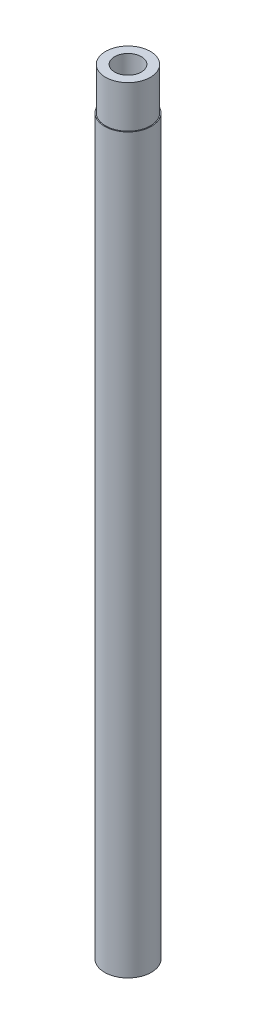
ISO-10303-21;
HEADER;
FILE_DESCRIPTION(('STEP AP214'),'2;1');
FILE_NAME('part.step','',(''),(''),'','','');
FILE_SCHEMA(('AUTOMOTIVE_DESIGN { 1 0 10303 214 1 1 1 1 }'));
ENDSEC;
DATA;
#1=APPLICATION_CONTEXT('core data for automotive mechanical design processes');
#2=APPLICATION_PROTOCOL_DEFINITION('international standard','automotive_design',2000,#1);
#3=PRODUCT_CONTEXT('',#1,'mechanical');
#4=PRODUCT('Part','Part','',(#3));
#5=PRODUCT_RELATED_PRODUCT_CATEGORY('part','',(#4));
#6=PRODUCT_DEFINITION_FORMATION('','',#4);
#7=PRODUCT_DEFINITION_CONTEXT('part definition',#1,'design');
#8=PRODUCT_DEFINITION('design','',#6,#7);
#9=PRODUCT_DEFINITION_SHAPE('','',#8);
#10=(LENGTH_UNIT() NAMED_UNIT(*) SI_UNIT(.MILLI.,.METRE.));
#11=(NAMED_UNIT(*) PLANE_ANGLE_UNIT() SI_UNIT($,.RADIAN.));
#12=(NAMED_UNIT(*) SI_UNIT($,.STERADIAN.) SOLID_ANGLE_UNIT());
#13=UNCERTAINTY_MEASURE_WITH_UNIT(LENGTH_MEASURE(1.E-05),#10,'distance_accuracy_value','');
#14=(GEOMETRIC_REPRESENTATION_CONTEXT(3) GLOBAL_UNCERTAINTY_ASSIGNED_CONTEXT((#13)) GLOBAL_UNIT_ASSIGNED_CONTEXT((#10,
#11,#12)) REPRESENTATION_CONTEXT('',''));
#15=CARTESIAN_POINT('',(0.,0.,0.));
#16=DIRECTION('',(0.,0.,1.));
#17=DIRECTION('',(1.,0.,0.));
#18=AXIS2_PLACEMENT_3D('',#15,#16,#17);
#19=CARTESIAN_POINT('',(0.,368.3,0.));
#20=DIRECTION('',(0.,-1.,0.));
#21=DIRECTION('',(0.,0.,-1.));
#22=AXIS2_PLACEMENT_3D('',#19,#20,#21);
#23=CYLINDRICAL_SURFACE('',#22,6.35);
#24=CARTESIAN_POINT('',(0.,368.3,0.));
#25=DIRECTION('',(0.,1.,0.));
#26=DIRECTION('',(0.,0.,1.));
#27=AXIS2_PLACEMENT_3D('',#24,#25,#26);
#28=CIRCLE('',#27,6.35);
#29=CARTESIAN_POINT('',(0.,368.3,6.35));
#30=VERTEX_POINT('',#29);
#31=EDGE_CURVE('E37',#30,#30,#28,.T.);
#32=ORIENTED_EDGE('',*,*,#31,.T.);
#33=EDGE_LOOP('',(#32));
#34=FACE_BOUND('',#33,.T.);
#35=CARTESIAN_POINT('',(0.,12.7,0.));
#36=DIRECTION('',(0.,-1.,0.));
#37=DIRECTION('',(0.,0.,-1.));
#38=AXIS2_PLACEMENT_3D('',#35,#36,#37);
#39=CIRCLE('',#38,6.35);
#40=CARTESIAN_POINT('',(0.,12.7,-6.35));
#41=VERTEX_POINT('',#40);
#42=EDGE_CURVE('E57',#41,#41,#39,.T.);
#43=ORIENTED_EDGE('',*,*,#42,.T.);
#44=EDGE_LOOP('',(#43));
#45=FACE_BOUND('',#44,.T.);
#46=ADVANCED_FACE('F30',(#34,#45),#23,.F.);
#47=CARTESIAN_POINT('',(0.,368.3,0.));
#48=DIRECTION('',(0.,1.,0.));
#49=DIRECTION('',(0.,0.,1.));
#50=AXIS2_PLACEMENT_3D('',#47,#48,#49);
#51=PLANE('',#50);
#52=ORIENTED_EDGE('',*,*,#31,.F.);
#53=EDGE_LOOP('',(#52));
#54=FACE_BOUND('',#53,.T.);
#55=CARTESIAN_POINT('',(0.,368.3,0.));
#56=DIRECTION('',(0.,1.,0.));
#57=DIRECTION('',(0.,0.,1.));
#58=AXIS2_PLACEMENT_3D('',#55,#56,#57);
#59=CIRCLE('',#58,10.668);
#60=CARTESIAN_POINT('',(0.,368.3,10.668));
#61=VERTEX_POINT('',#60);
#62=EDGE_CURVE('E48',#61,#61,#59,.T.);
#63=ORIENTED_EDGE('',*,*,#62,.T.);
#64=EDGE_LOOP('',(#63));
#65=FACE_BOUND('',#64,.T.);
#66=ADVANCED_FACE('F87',(#54,#65),#51,.T.);
#67=CARTESIAN_POINT('',(0.,368.3,0.));
#68=DIRECTION('',(0.,-1.,0.));
#69=DIRECTION('',(0.,0.,-1.));
#70=AXIS2_PLACEMENT_3D('',#67,#68,#69);
#71=CYLINDRICAL_SURFACE('',#70,11.1125);
#72=CARTESIAN_POINT('',(0.,0.,0.));
#73=DIRECTION('',(0.,1.,0.));
#74=DIRECTION('',(0.,0.,1.));
#75=AXIS2_PLACEMENT_3D('',#72,#73,#74);
#76=CIRCLE('',#75,11.1125);
#77=CARTESIAN_POINT('',(0.,0.,11.1125));
#78=VERTEX_POINT('',#77);
#79=EDGE_CURVE('E10',#78,#78,#76,.T.);
#80=ORIENTED_EDGE('',*,*,#79,.T.);
#81=EDGE_LOOP('',(#80));
#82=FACE_BOUND('',#81,.T.);
#83=CARTESIAN_POINT('',(0.,348.3,0.));
#84=DIRECTION('',(0.,1.,0.));
#85=DIRECTION('',(0.,0.,1.));
#86=AXIS2_PLACEMENT_3D('',#83,#84,#85);
#87=CIRCLE('',#86,11.1125);
#88=CARTESIAN_POINT('',(0.,348.3,11.1125));
#89=VERTEX_POINT('',#88);
#90=EDGE_CURVE('E41',#89,#89,#87,.T.);
#91=ORIENTED_EDGE('',*,*,#90,.F.);
#92=EDGE_LOOP('',(#91));
#93=FACE_BOUND('',#92,.T.);
#94=ADVANCED_FACE('F32',(#82,#93),#71,.T.);
#95=CARTESIAN_POINT('',(0.,0.,0.));
#96=DIRECTION('',(0.,1.,0.));
#97=DIRECTION('',(0.,0.,1.));
#98=AXIS2_PLACEMENT_3D('',#95,#96,#97);
#99=PLANE('',#98);
#100=CARTESIAN_POINT('',(0.,0.,0.));
#101=DIRECTION('',(0.,-1.,0.));
#102=DIRECTION('',(0.,0.,-1.));
#103=AXIS2_PLACEMENT_3D('',#100,#101,#102);
#104=CIRCLE('',#103,7.14375);
#105=CARTESIAN_POINT('',(0.,0.,-7.14375));
#106=VERTEX_POINT('',#105);
#107=EDGE_CURVE('E54',#106,#106,#104,.T.);
#108=ORIENTED_EDGE('',*,*,#107,.F.);
#109=EDGE_LOOP('',(#108));
#110=FACE_BOUND('',#109,.T.);
#111=ORIENTED_EDGE('',*,*,#79,.F.);
#112=EDGE_LOOP('',(#111));
#113=FACE_BOUND('',#112,.T.);
#114=ADVANCED_FACE('F77',(#110,#113),#99,.F.);
#115=CARTESIAN_POINT('',(0.,348.3,0.));
#116=DIRECTION('',(0.,1.,0.));
#117=DIRECTION('',(0.,0.,1.));
#118=AXIS2_PLACEMENT_3D('',#115,#116,#117);
#119=PLANE('',#118);
#120=CARTESIAN_POINT('',(0.,348.3,0.));
#121=DIRECTION('',(0.,1.,0.));
#122=DIRECTION('',(0.,0.,1.));
#123=AXIS2_PLACEMENT_3D('',#120,#121,#122);
#124=CIRCLE('',#123,10.668);
#125=CARTESIAN_POINT('',(0.,348.3,10.668));
#126=VERTEX_POINT('',#125);
#127=EDGE_CURVE('E45',#126,#126,#124,.T.);
#128=ORIENTED_EDGE('',*,*,#127,.F.);
#129=EDGE_LOOP('',(#128));
#130=FACE_BOUND('',#129,.T.);
#131=ORIENTED_EDGE('',*,*,#90,.T.);
#132=EDGE_LOOP('',(#131));
#133=FACE_BOUND('',#132,.T.);
#134=ADVANCED_FACE('F80',(#130,#133),#119,.T.);
#135=CARTESIAN_POINT('',(0.,348.3,0.));
#136=DIRECTION('',(0.,1.,0.));
#137=DIRECTION('',(0.,0.,1.));
#138=AXIS2_PLACEMENT_3D('',#135,#136,#137);
#139=CYLINDRICAL_SURFACE('',#138,10.668);
#140=ORIENTED_EDGE('',*,*,#127,.T.);
#141=EDGE_LOOP('',(#140));
#142=FACE_BOUND('',#141,.T.);
#143=ORIENTED_EDGE('',*,*,#62,.F.);
#144=EDGE_LOOP('',(#143));
#145=FACE_BOUND('',#144,.T.);
#146=ADVANCED_FACE('F73',(#142,#145),#139,.T.);
#147=CARTESIAN_POINT('',(0.,12.7,0.));
#148=DIRECTION('',(0.,-1.,0.));
#149=DIRECTION('',(0.,0.,-1.));
#150=AXIS2_PLACEMENT_3D('',#147,#148,#149);
#151=CYLINDRICAL_SURFACE('',#150,7.14375);
#152=CARTESIAN_POINT('',(0.,12.7,0.));
#153=DIRECTION('',(0.,-1.,0.));
#154=DIRECTION('',(0.,0.,-1.));
#155=AXIS2_PLACEMENT_3D('',#152,#153,#154);
#156=CIRCLE('',#155,7.14375);
#157=CARTESIAN_POINT('',(0.,12.7,-7.14375));
#158=VERTEX_POINT('',#157);
#159=EDGE_CURVE('E51',#158,#158,#156,.T.);
#160=ORIENTED_EDGE('',*,*,#159,.F.);
#161=EDGE_LOOP('',(#160));
#162=FACE_BOUND('',#161,.T.);
#163=ORIENTED_EDGE('',*,*,#107,.T.);
#164=EDGE_LOOP('',(#163));
#165=FACE_BOUND('',#164,.T.);
#166=ADVANCED_FACE('F67',(#162,#165),#151,.F.);
#167=CARTESIAN_POINT('',(0.,12.7,0.));
#168=DIRECTION('',(0.,-1.,0.));
#169=DIRECTION('',(0.,0.,-1.));
#170=AXIS2_PLACEMENT_3D('',#167,#168,#169);
#171=PLANE('',#170);
#172=ORIENTED_EDGE('',*,*,#42,.F.);
#173=EDGE_LOOP('',(#172));
#174=FACE_BOUND('',#173,.T.);
#175=ORIENTED_EDGE('',*,*,#159,.T.);
#176=EDGE_LOOP('',(#175));
#177=FACE_BOUND('',#176,.T.);
#178=ADVANCED_FACE('F64',(#174,#177),#171,.T.);
#179=CLOSED_SHELL('',(#46,#66,#94,#114,#134,#146,#166,#178));
#180=MANIFOLD_SOLID_BREP('B2',#179);
#181=ADVANCED_BREP_SHAPE_REPRESENTATION('',(#18,#180),#14);
#182=SHAPE_DEFINITION_REPRESENTATION(#9,#181);
ENDSEC;
END-ISO-10303-21;
